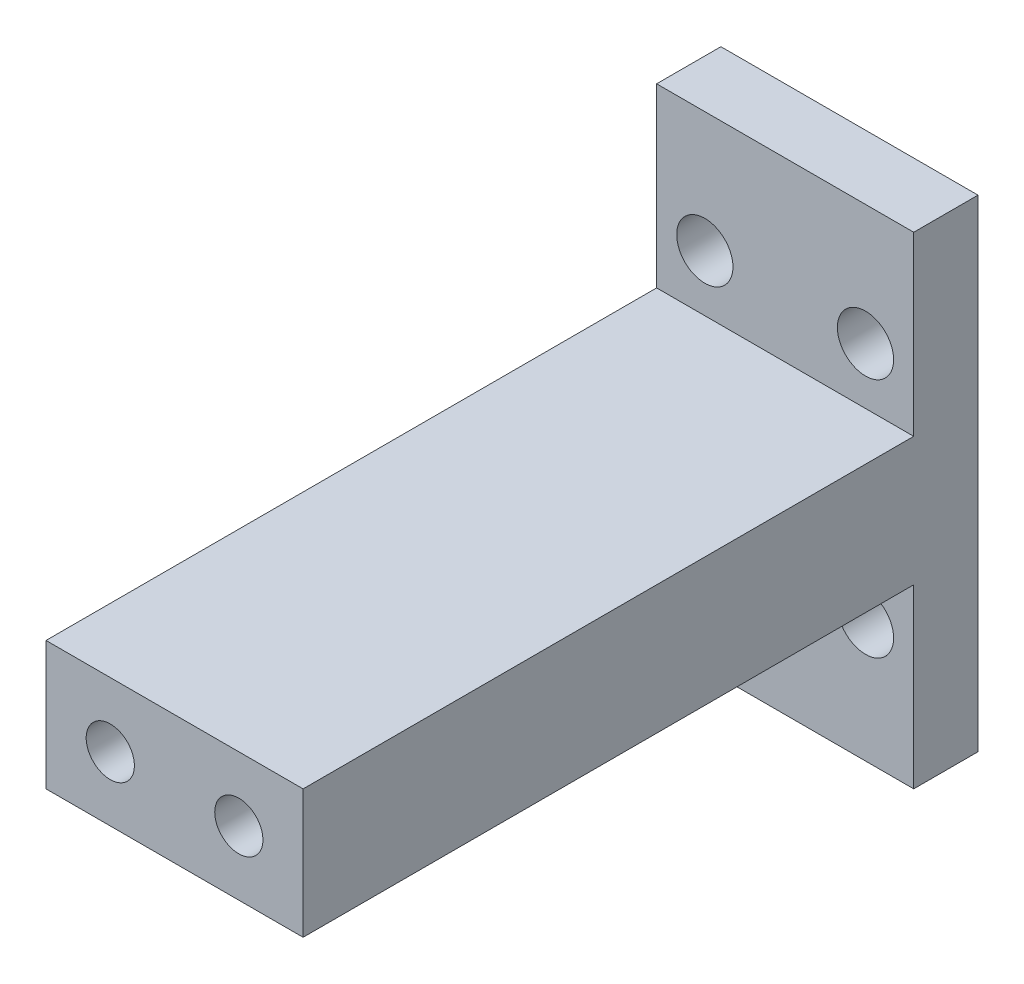
ISO-10303-21;
HEADER;
FILE_DESCRIPTION(('STEP AP214'),'2;1');
FILE_NAME('part.step','',(''),(''),'','','');
FILE_SCHEMA(('AUTOMOTIVE_DESIGN { 1 0 10303 214 1 1 1 1 }'));
ENDSEC;
DATA;
#1=APPLICATION_CONTEXT('core data for automotive mechanical design processes');
#2=APPLICATION_PROTOCOL_DEFINITION('international standard','automotive_design',2000,#1);
#3=PRODUCT_CONTEXT('',#1,'mechanical');
#4=PRODUCT('Part','Part','',(#3));
#5=PRODUCT_RELATED_PRODUCT_CATEGORY('part','',(#4));
#6=PRODUCT_DEFINITION_FORMATION('','',#4);
#7=PRODUCT_DEFINITION_CONTEXT('part definition',#1,'design');
#8=PRODUCT_DEFINITION('design','',#6,#7);
#9=PRODUCT_DEFINITION_SHAPE('','',#8);
#10=(LENGTH_UNIT() NAMED_UNIT(*) SI_UNIT(.MILLI.,.METRE.));
#11=(NAMED_UNIT(*) PLANE_ANGLE_UNIT() SI_UNIT($,.RADIAN.));
#12=(NAMED_UNIT(*) SI_UNIT($,.STERADIAN.) SOLID_ANGLE_UNIT());
#13=UNCERTAINTY_MEASURE_WITH_UNIT(LENGTH_MEASURE(1.E-05),#10,'distance_accuracy_value','');
#14=(GEOMETRIC_REPRESENTATION_CONTEXT(3) GLOBAL_UNCERTAINTY_ASSIGNED_CONTEXT((#13)) GLOBAL_UNIT_ASSIGNED_CONTEXT((#10,
#11,#12)) REPRESENTATION_CONTEXT('',''));
#15=CARTESIAN_POINT('',(0.,0.,0.));
#16=DIRECTION('',(0.,0.,1.));
#17=DIRECTION('',(1.,0.,0.));
#18=AXIS2_PLACEMENT_3D('',#15,#16,#17);
#19=CARTESIAN_POINT('',(0.,0.,4.));
#20=DIRECTION('',(0.,0.,1.));
#21=DIRECTION('',(1.,0.,0.));
#22=AXIS2_PLACEMENT_3D('',#19,#20,#21);
#23=PLANE('',#22);
#24=DIRECTION('',(1.,0.,0.));
#25=VECTOR('',#24,1.);
#26=CARTESIAN_POINT('',(-8.,-4.,4.));
#27=LINE('',#26,#25);
#28=CARTESIAN_POINT('',(-8.,-4.,4.));
#29=VERTEX_POINT('',#28);
#30=CARTESIAN_POINT('',(8.,-4.,4.));
#31=VERTEX_POINT('',#30);
#32=EDGE_CURVE('E55',#29,#31,#27,.T.);
#33=ORIENTED_EDGE('',*,*,#32,.F.);
#34=DIRECTION('',(0.,-1.,0.));
#35=VECTOR('',#34,1.);
#36=CARTESIAN_POINT('',(-8.,15.,4.));
#37=LINE('',#36,#35);
#38=CARTESIAN_POINT('',(-8.,-15.,4.));
#39=VERTEX_POINT('',#38);
#40=EDGE_CURVE('E176',#29,#39,#37,.T.);
#41=ORIENTED_EDGE('',*,*,#40,.T.);
#42=DIRECTION('',(1.,0.,0.));
#43=VECTOR('',#42,1.);
#44=CARTESIAN_POINT('',(-8.,-15.,4.));
#45=LINE('',#44,#43);
#46=CARTESIAN_POINT('',(8.,-15.,4.));
#47=VERTEX_POINT('',#46);
#48=EDGE_CURVE('E180',#39,#47,#45,.T.);
#49=ORIENTED_EDGE('',*,*,#48,.T.);
#50=DIRECTION('',(0.,1.,0.));
#51=VECTOR('',#50,1.);
#52=CARTESIAN_POINT('',(8.,15.,4.));
#53=LINE('',#52,#51);
#54=EDGE_CURVE('E170',#47,#31,#53,.T.);
#55=ORIENTED_EDGE('',*,*,#54,.T.);
#56=EDGE_LOOP('',(#33,#41,#49,#55));
#57=FACE_BOUND('',#56,.T.);
#58=CARTESIAN_POINT('',(-5.,-7.5,4.));
#59=DIRECTION('',(0.,0.,1.));
#60=DIRECTION('',(-1.,0.,0.));
#61=AXIS2_PLACEMENT_3D('',#58,#59,#60);
#62=CIRCLE('',#61,1.75);
#63=CARTESIAN_POINT('',(-6.75,-7.5,4.));
#64=VERTEX_POINT('',#63);
#65=EDGE_CURVE('E136',#64,#64,#62,.T.);
#66=ORIENTED_EDGE('',*,*,#65,.F.);
#67=EDGE_LOOP('',(#66));
#68=FACE_BOUND('',#67,.T.);
#69=CARTESIAN_POINT('',(5.,-7.5,4.));
#70=DIRECTION('',(0.,0.,1.));
#71=DIRECTION('',(1.,0.,0.));
#72=AXIS2_PLACEMENT_3D('',#69,#70,#71);
#73=CIRCLE('',#72,1.75);
#74=CARTESIAN_POINT('',(6.75,-7.5,4.));
#75=VERTEX_POINT('',#74);
#76=EDGE_CURVE('E146',#75,#75,#73,.T.);
#77=ORIENTED_EDGE('',*,*,#76,.F.);
#78=EDGE_LOOP('',(#77));
#79=FACE_BOUND('',#78,.T.);
#80=ADVANCED_FACE('F39',(#57,#68,#79),#23,.T.);
#81=DIRECTION('',(-1.,0.,0.));
#82=VECTOR('',#81,1.);
#83=CARTESIAN_POINT('',(-8.,4.,4.));
#84=LINE('',#83,#82);
#85=CARTESIAN_POINT('',(8.,4.,4.));
#86=VERTEX_POINT('',#85);
#87=CARTESIAN_POINT('',(-8.,4.,4.));
#88=VERTEX_POINT('',#87);
#89=EDGE_CURVE('E63',#86,#88,#84,.T.);
#90=ORIENTED_EDGE('',*,*,#89,.F.);
#91=CARTESIAN_POINT('',(8.,15.,4.));
#92=VERTEX_POINT('',#91);
#93=EDGE_CURVE('E129',#86,#92,#53,.T.);
#94=ORIENTED_EDGE('',*,*,#93,.T.);
#95=DIRECTION('',(-1.,0.,0.));
#96=VECTOR('',#95,1.);
#97=CARTESIAN_POINT('',(-8.,15.,4.));
#98=LINE('',#97,#96);
#99=CARTESIAN_POINT('',(-8.,15.,4.));
#100=VERTEX_POINT('',#99);
#101=EDGE_CURVE('E173',#92,#100,#98,.T.);
#102=ORIENTED_EDGE('',*,*,#101,.T.);
#103=EDGE_CURVE('E177',#100,#88,#37,.T.);
#104=ORIENTED_EDGE('',*,*,#103,.T.);
#105=EDGE_LOOP('',(#90,#94,#102,#104));
#106=FACE_BOUND('',#105,.T.);
#107=CARTESIAN_POINT('',(-5.,7.5,4.));
#108=DIRECTION('',(0.,0.,1.));
#109=DIRECTION('',(1.,0.,0.));
#110=AXIS2_PLACEMENT_3D('',#107,#108,#109);
#111=CIRCLE('',#110,1.75);
#112=CARTESIAN_POINT('',(-3.25,7.5,4.));
#113=VERTEX_POINT('',#112);
#114=EDGE_CURVE('E162',#113,#113,#111,.T.);
#115=ORIENTED_EDGE('',*,*,#114,.F.);
#116=EDGE_LOOP('',(#115));
#117=FACE_BOUND('',#116,.T.);
#118=CARTESIAN_POINT('',(5.,7.5,4.));
#119=DIRECTION('',(0.,0.,1.));
#120=DIRECTION('',(-1.,0.,0.));
#121=AXIS2_PLACEMENT_3D('',#118,#119,#120);
#122=CIRCLE('',#121,1.75);
#123=CARTESIAN_POINT('',(3.25,7.5,4.));
#124=VERTEX_POINT('',#123);
#125=EDGE_CURVE('E154',#124,#124,#122,.T.);
#126=ORIENTED_EDGE('',*,*,#125,.F.);
#127=EDGE_LOOP('',(#126));
#128=FACE_BOUND('',#127,.T.);
#129=ADVANCED_FACE('F281',(#106,#117,#128),#23,.T.);
#130=CARTESIAN_POINT('',(0.,0.,0.));
#131=DIRECTION('',(0.,0.,1.));
#132=DIRECTION('',(1.,0.,0.));
#133=AXIS2_PLACEMENT_3D('',#130,#131,#132);
#134=PLANE('',#133);
#135=DIRECTION('',(0.,1.,0.));
#136=VECTOR('',#135,1.);
#137=CARTESIAN_POINT('',(8.,15.,0.));
#138=LINE('',#137,#136);
#139=CARTESIAN_POINT('',(8.,-15.,0.));
#140=VERTEX_POINT('',#139);
#141=CARTESIAN_POINT('',(8.,15.,0.));
#142=VERTEX_POINT('',#141);
#143=EDGE_CURVE('E166',#140,#142,#138,.T.);
#144=ORIENTED_EDGE('',*,*,#143,.F.);
#145=DIRECTION('',(1.,0.,0.));
#146=VECTOR('',#145,1.);
#147=CARTESIAN_POINT('',(-8.,-15.,0.));
#148=LINE('',#147,#146);
#149=CARTESIAN_POINT('',(-8.,-15.,0.));
#150=VERTEX_POINT('',#149);
#151=EDGE_CURVE('E192',#150,#140,#148,.T.);
#152=ORIENTED_EDGE('',*,*,#151,.F.);
#153=DIRECTION('',(0.,-1.,0.));
#154=VECTOR('',#153,1.);
#155=CARTESIAN_POINT('',(-8.,15.,0.));
#156=LINE('',#155,#154);
#157=CARTESIAN_POINT('',(-8.,15.,0.));
#158=VERTEX_POINT('',#157);
#159=EDGE_CURVE('E189',#158,#150,#156,.T.);
#160=ORIENTED_EDGE('',*,*,#159,.F.);
#161=DIRECTION('',(-1.,0.,0.));
#162=VECTOR('',#161,1.);
#163=CARTESIAN_POINT('',(-8.,15.,0.));
#164=LINE('',#163,#162);
#165=EDGE_CURVE('E186',#142,#158,#164,.T.);
#166=ORIENTED_EDGE('',*,*,#165,.F.);
#167=EDGE_LOOP('',(#144,#152,#160,#166));
#168=FACE_BOUND('',#167,.T.);
#169=CARTESIAN_POINT('',(-5.,7.5,0.));
#170=DIRECTION('',(0.,0.,1.));
#171=DIRECTION('',(1.,0.,0.));
#172=AXIS2_PLACEMENT_3D('',#169,#170,#171);
#173=CIRCLE('',#172,1.75);
#174=CARTESIAN_POINT('',(-3.25,7.5,0.));
#175=VERTEX_POINT('',#174);
#176=EDGE_CURVE('E158',#175,#175,#173,.T.);
#177=ORIENTED_EDGE('',*,*,#176,.T.);
#178=EDGE_LOOP('',(#177));
#179=FACE_BOUND('',#178,.T.);
#180=CARTESIAN_POINT('',(5.,7.5,0.));
#181=DIRECTION('',(0.,0.,1.));
#182=DIRECTION('',(-1.,0.,0.));
#183=AXIS2_PLACEMENT_3D('',#180,#181,#182);
#184=CIRCLE('',#183,1.75);
#185=CARTESIAN_POINT('',(3.25,7.5,0.));
#186=VERTEX_POINT('',#185);
#187=EDGE_CURVE('E150',#186,#186,#184,.T.);
#188=ORIENTED_EDGE('',*,*,#187,.T.);
#189=EDGE_LOOP('',(#188));
#190=FACE_BOUND('',#189,.T.);
#191=CARTESIAN_POINT('',(5.,-7.5,0.));
#192=DIRECTION('',(0.,0.,1.));
#193=DIRECTION('',(1.,0.,0.));
#194=AXIS2_PLACEMENT_3D('',#191,#192,#193);
#195=CIRCLE('',#194,1.75);
#196=CARTESIAN_POINT('',(6.75,-7.5,0.));
#197=VERTEX_POINT('',#196);
#198=EDGE_CURVE('E144',#197,#197,#195,.T.);
#199=ORIENTED_EDGE('',*,*,#198,.T.);
#200=EDGE_LOOP('',(#199));
#201=FACE_BOUND('',#200,.T.);
#202=CARTESIAN_POINT('',(-5.,-7.5,0.));
#203=DIRECTION('',(0.,0.,1.));
#204=DIRECTION('',(-1.,0.,0.));
#205=AXIS2_PLACEMENT_3D('',#202,#203,#204);
#206=CIRCLE('',#205,1.75);
#207=CARTESIAN_POINT('',(-6.75,-7.5,0.));
#208=VERTEX_POINT('',#207);
#209=EDGE_CURVE('E131',#208,#208,#206,.T.);
#210=ORIENTED_EDGE('',*,*,#209,.T.);
#211=EDGE_LOOP('',(#210));
#212=FACE_BOUND('',#211,.T.);
#213=ADVANCED_FACE('F214',(#168,#179,#190,#201,#212),#134,.F.);
#214=CARTESIAN_POINT('',(8.,15.,4.));
#215=DIRECTION('',(-1.,0.,0.));
#216=DIRECTION('',(0.,-1.,0.));
#217=AXIS2_PLACEMENT_3D('',#214,#215,#216);
#218=PLANE('',#217);
#219=ORIENTED_EDGE('',*,*,#143,.T.);
#220=DIRECTION('',(0.,0.,-1.));
#221=VECTOR('',#220,1.);
#222=CARTESIAN_POINT('',(8.,15.,4.));
#223=LINE('',#222,#221);
#224=EDGE_CURVE('E11',#92,#142,#223,.T.);
#225=ORIENTED_EDGE('',*,*,#224,.F.);
#226=ORIENTED_EDGE('',*,*,#93,.F.);
#227=DIRECTION('',(0.,0.,-1.));
#228=VECTOR('',#227,1.);
#229=CARTESIAN_POINT('',(8.,4.,42.));
#230=LINE('',#229,#228);
#231=CARTESIAN_POINT('',(8.,4.,42.));
#232=VERTEX_POINT('',#231);
#233=EDGE_CURVE('E109',#232,#86,#230,.T.);
#234=ORIENTED_EDGE('',*,*,#233,.F.);
#235=DIRECTION('',(0.,1.,0.));
#236=VECTOR('',#235,1.);
#237=CARTESIAN_POINT('',(8.,4.,42.));
#238=LINE('',#237,#236);
#239=CARTESIAN_POINT('',(8.,-4.,42.));
#240=VERTEX_POINT('',#239);
#241=EDGE_CURVE('E116',#240,#232,#238,.T.);
#242=ORIENTED_EDGE('',*,*,#241,.F.);
#243=DIRECTION('',(0.,0.,-1.));
#244=VECTOR('',#243,1.);
#245=CARTESIAN_POINT('',(8.,-4.,42.));
#246=LINE('',#245,#244);
#247=EDGE_CURVE('E221',#240,#31,#246,.T.);
#248=ORIENTED_EDGE('',*,*,#247,.T.);
#249=ORIENTED_EDGE('',*,*,#54,.F.);
#250=DIRECTION('',(0.,0.,-1.));
#251=VECTOR('',#250,1.);
#252=CARTESIAN_POINT('',(8.,-15.,4.));
#253=LINE('',#252,#251);
#254=EDGE_CURVE('E183',#47,#140,#253,.T.);
#255=ORIENTED_EDGE('',*,*,#254,.T.);
#256=EDGE_LOOP('',(#219,#225,#226,#234,#242,#248,#249,#255));
#257=FACE_BOUND('',#256,.T.);
#258=ADVANCED_FACE('F41',(#257),#218,.F.);
#259=CARTESIAN_POINT('',(-8.,15.,4.));
#260=DIRECTION('',(0.,-1.,0.));
#261=DIRECTION('',(0.,0.,-1.));
#262=AXIS2_PLACEMENT_3D('',#259,#260,#261);
#263=PLANE('',#262);
#264=ORIENTED_EDGE('',*,*,#165,.T.);
#265=DIRECTION('',(0.,0.,-1.));
#266=VECTOR('',#265,1.);
#267=CARTESIAN_POINT('',(-8.,15.,4.));
#268=LINE('',#267,#266);
#269=EDGE_CURVE('E48',#100,#158,#268,.T.);
#270=ORIENTED_EDGE('',*,*,#269,.F.);
#271=ORIENTED_EDGE('',*,*,#101,.F.);
#272=ORIENTED_EDGE('',*,*,#224,.T.);
#273=EDGE_LOOP('',(#264,#270,#271,#272));
#274=FACE_BOUND('',#273,.T.);
#275=ADVANCED_FACE('F296',(#274),#263,.F.);
#276=CARTESIAN_POINT('',(-8.,15.,4.));
#277=DIRECTION('',(1.,0.,0.));
#278=DIRECTION('',(0.,1.,0.));
#279=AXIS2_PLACEMENT_3D('',#276,#277,#278);
#280=PLANE('',#279);
#281=ORIENTED_EDGE('',*,*,#159,.T.);
#282=DIRECTION('',(0.,0.,-1.));
#283=VECTOR('',#282,1.);
#284=CARTESIAN_POINT('',(-8.,-15.,4.));
#285=LINE('',#284,#283);
#286=EDGE_CURVE('E198',#39,#150,#285,.T.);
#287=ORIENTED_EDGE('',*,*,#286,.F.);
#288=ORIENTED_EDGE('',*,*,#40,.F.);
#289=DIRECTION('',(0.,0.,-1.));
#290=VECTOR('',#289,1.);
#291=CARTESIAN_POINT('',(-8.,-4.,42.));
#292=LINE('',#291,#290);
#293=CARTESIAN_POINT('',(-8.,-4.,42.));
#294=VERTEX_POINT('',#293);
#295=EDGE_CURVE('E138',#294,#29,#292,.T.);
#296=ORIENTED_EDGE('',*,*,#295,.F.);
#297=DIRECTION('',(0.,-1.,0.));
#298=VECTOR('',#297,1.);
#299=CARTESIAN_POINT('',(-8.,4.,42.));
#300=LINE('',#299,#298);
#301=CARTESIAN_POINT('',(-8.,4.,42.));
#302=VERTEX_POINT('',#301);
#303=EDGE_CURVE('E115',#302,#294,#300,.T.);
#304=ORIENTED_EDGE('',*,*,#303,.F.);
#305=DIRECTION('',(0.,0.,-1.));
#306=VECTOR('',#305,1.);
#307=CARTESIAN_POINT('',(-8.,4.,42.));
#308=LINE('',#307,#306);
#309=EDGE_CURVE('E111',#302,#88,#308,.T.);
#310=ORIENTED_EDGE('',*,*,#309,.T.);
#311=ORIENTED_EDGE('',*,*,#103,.F.);
#312=ORIENTED_EDGE('',*,*,#269,.T.);
#313=EDGE_LOOP('',(#281,#287,#288,#296,#304,#310,#311,#312));
#314=FACE_BOUND('',#313,.T.);
#315=ADVANCED_FACE('F207',(#314),#280,.F.);
#316=CARTESIAN_POINT('',(-8.,-15.,4.));
#317=DIRECTION('',(0.,1.,0.));
#318=DIRECTION('',(0.,0.,1.));
#319=AXIS2_PLACEMENT_3D('',#316,#317,#318);
#320=PLANE('',#319);
#321=ORIENTED_EDGE('',*,*,#151,.T.);
#322=ORIENTED_EDGE('',*,*,#254,.F.);
#323=ORIENTED_EDGE('',*,*,#48,.F.);
#324=ORIENTED_EDGE('',*,*,#286,.T.);
#325=EDGE_LOOP('',(#321,#322,#323,#324));
#326=FACE_BOUND('',#325,.T.);
#327=ADVANCED_FACE('F218',(#326),#320,.F.);
#328=CARTESIAN_POINT('',(-5.,7.5,4.));
#329=DIRECTION('',(0.,0.,-1.));
#330=DIRECTION('',(-1.,0.,0.));
#331=AXIS2_PLACEMENT_3D('',#328,#329,#330);
#332=CYLINDRICAL_SURFACE('',#331,1.75);
#333=ORIENTED_EDGE('',*,*,#114,.T.);
#334=EDGE_LOOP('',(#333));
#335=FACE_BOUND('',#334,.T.);
#336=ORIENTED_EDGE('',*,*,#176,.F.);
#337=EDGE_LOOP('',(#336));
#338=FACE_BOUND('',#337,.T.);
#339=ADVANCED_FACE('F289',(#335,#338),#332,.F.);
#340=CARTESIAN_POINT('',(5.,7.5,4.));
#341=DIRECTION('',(0.,0.,-1.));
#342=DIRECTION('',(-1.,0.,0.));
#343=AXIS2_PLACEMENT_3D('',#340,#341,#342);
#344=CYLINDRICAL_SURFACE('',#343,1.75);
#345=ORIENTED_EDGE('',*,*,#125,.T.);
#346=EDGE_LOOP('',(#345));
#347=FACE_BOUND('',#346,.T.);
#348=ORIENTED_EDGE('',*,*,#187,.F.);
#349=EDGE_LOOP('',(#348));
#350=FACE_BOUND('',#349,.T.);
#351=ADVANCED_FACE('F308',(#347,#350),#344,.F.);
#352=CARTESIAN_POINT('',(5.,-7.5,4.));
#353=DIRECTION('',(0.,0.,-1.));
#354=DIRECTION('',(-1.,0.,0.));
#355=AXIS2_PLACEMENT_3D('',#352,#353,#354);
#356=CYLINDRICAL_SURFACE('',#355,1.75);
#357=ORIENTED_EDGE('',*,*,#76,.T.);
#358=EDGE_LOOP('',(#357));
#359=FACE_BOUND('',#358,.T.);
#360=ORIENTED_EDGE('',*,*,#198,.F.);
#361=EDGE_LOOP('',(#360));
#362=FACE_BOUND('',#361,.T.);
#363=ADVANCED_FACE('F311',(#359,#362),#356,.F.);
#364=CARTESIAN_POINT('',(-5.,-7.5,4.));
#365=DIRECTION('',(0.,0.,-1.));
#366=DIRECTION('',(-1.,0.,0.));
#367=AXIS2_PLACEMENT_3D('',#364,#365,#366);
#368=CYLINDRICAL_SURFACE('',#367,1.75);
#369=ORIENTED_EDGE('',*,*,#65,.T.);
#370=EDGE_LOOP('',(#369));
#371=FACE_BOUND('',#370,.T.);
#372=ORIENTED_EDGE('',*,*,#209,.F.);
#373=EDGE_LOOP('',(#372));
#374=FACE_BOUND('',#373,.T.);
#375=ADVANCED_FACE('F319',(#371,#374),#368,.F.);
#376=CARTESIAN_POINT('',(-8.,4.,42.));
#377=DIRECTION('',(0.,-1.,0.));
#378=DIRECTION('',(0.,0.,-1.));
#379=AXIS2_PLACEMENT_3D('',#376,#377,#378);
#380=PLANE('',#379);
#381=ORIENTED_EDGE('',*,*,#89,.T.);
#382=ORIENTED_EDGE('',*,*,#309,.F.);
#383=DIRECTION('',(-1.,0.,0.));
#384=VECTOR('',#383,1.);
#385=CARTESIAN_POINT('',(-8.,4.,42.));
#386=LINE('',#385,#384);
#387=EDGE_CURVE('E105',#232,#302,#386,.T.);
#388=ORIENTED_EDGE('',*,*,#387,.F.);
#389=ORIENTED_EDGE('',*,*,#233,.T.);
#390=EDGE_LOOP('',(#381,#382,#388,#389));
#391=FACE_BOUND('',#390,.T.);
#392=ADVANCED_FACE('F107',(#391),#380,.F.);
#393=CARTESIAN_POINT('',(-8.,-4.,42.));
#394=DIRECTION('',(0.,1.,0.));
#395=DIRECTION('',(0.,0.,1.));
#396=AXIS2_PLACEMENT_3D('',#393,#394,#395);
#397=PLANE('',#396);
#398=ORIENTED_EDGE('',*,*,#32,.T.);
#399=ORIENTED_EDGE('',*,*,#247,.F.);
#400=DIRECTION('',(1.,0.,0.));
#401=VECTOR('',#400,1.);
#402=CARTESIAN_POINT('',(-8.,-4.,42.));
#403=LINE('',#402,#401);
#404=EDGE_CURVE('E121',#294,#240,#403,.T.);
#405=ORIENTED_EDGE('',*,*,#404,.F.);
#406=ORIENTED_EDGE('',*,*,#295,.T.);
#407=EDGE_LOOP('',(#398,#399,#405,#406));
#408=FACE_BOUND('',#407,.T.);
#409=ADVANCED_FACE('F225',(#408),#397,.F.);
#410=CARTESIAN_POINT('',(0.,0.,42.));
#411=DIRECTION('',(0.,0.,1.));
#412=DIRECTION('',(1.,0.,0.));
#413=AXIS2_PLACEMENT_3D('',#410,#411,#412);
#414=PLANE('',#413);
#415=CARTESIAN_POINT('',(-4.,0.,42.));
#416=DIRECTION('',(0.,0.,1.));
#417=DIRECTION('',(1.,0.,0.));
#418=AXIS2_PLACEMENT_3D('',#415,#416,#417);
#419=CIRCLE('',#418,1.5);
#420=CARTESIAN_POINT('',(-2.5,0.,42.));
#421=VERTEX_POINT('',#420);
#422=EDGE_CURVE('E248',#421,#421,#419,.T.);
#423=ORIENTED_EDGE('',*,*,#422,.F.);
#424=EDGE_LOOP('',(#423));
#425=FACE_BOUND('',#424,.T.);
#426=CARTESIAN_POINT('',(4.,0.,42.));
#427=DIRECTION('',(0.,0.,1.));
#428=DIRECTION('',(-1.,0.,0.));
#429=AXIS2_PLACEMENT_3D('',#426,#427,#428);
#430=CIRCLE('',#429,1.5);
#431=CARTESIAN_POINT('',(2.5,0.,42.));
#432=VERTEX_POINT('',#431);
#433=EDGE_CURVE('E240',#432,#432,#430,.T.);
#434=ORIENTED_EDGE('',*,*,#433,.F.);
#435=EDGE_LOOP('',(#434));
#436=FACE_BOUND('',#435,.T.);
#437=ORIENTED_EDGE('',*,*,#241,.T.);
#438=ORIENTED_EDGE('',*,*,#387,.T.);
#439=ORIENTED_EDGE('',*,*,#303,.T.);
#440=ORIENTED_EDGE('',*,*,#404,.T.);
#441=EDGE_LOOP('',(#437,#438,#439,#440));
#442=FACE_BOUND('',#441,.T.);
#443=ADVANCED_FACE('F119',(#425,#436,#442),#414,.T.);
#444=CARTESIAN_POINT('',(4.,0.,32.));
#445=DIRECTION('',(0.,0.,1.));
#446=DIRECTION('',(1.,0.,0.));
#447=AXIS2_PLACEMENT_3D('',#444,#445,#446);
#448=CYLINDRICAL_SURFACE('',#447,1.5);
#449=CARTESIAN_POINT('',(4.,0.,32.));
#450=DIRECTION('',(0.,0.,1.));
#451=DIRECTION('',(-1.,0.,0.));
#452=AXIS2_PLACEMENT_3D('',#449,#450,#451);
#453=CIRCLE('',#452,1.5);
#454=CARTESIAN_POINT('',(2.5,0.,32.));
#455=VERTEX_POINT('',#454);
#456=EDGE_CURVE('E244',#455,#455,#453,.T.);
#457=ORIENTED_EDGE('',*,*,#456,.F.);
#458=EDGE_LOOP('',(#457));
#459=FACE_BOUND('',#458,.T.);
#460=ORIENTED_EDGE('',*,*,#433,.T.);
#461=EDGE_LOOP('',(#460));
#462=FACE_BOUND('',#461,.T.);
#463=ADVANCED_FACE('F267',(#459,#462),#448,.F.);
#464=CARTESIAN_POINT('',(4.,0.,32.));
#465=DIRECTION('',(0.,0.,-1.));
#466=DIRECTION('',(-1.,0.,0.));
#467=AXIS2_PLACEMENT_3D('',#464,#465,#466);
#468=PLANE('',#467);
#469=ORIENTED_EDGE('',*,*,#456,.T.);
#470=EDGE_LOOP('',(#469));
#471=FACE_BOUND('',#470,.T.);
#472=ADVANCED_FACE('F261',(#471),#468,.F.);
#473=CARTESIAN_POINT('',(-4.,0.,32.));
#474=DIRECTION('',(0.,0.,1.));
#475=DIRECTION('',(1.,0.,0.));
#476=AXIS2_PLACEMENT_3D('',#473,#474,#475);
#477=CYLINDRICAL_SURFACE('',#476,1.5);
#478=CARTESIAN_POINT('',(-4.,0.,32.));
#479=DIRECTION('',(0.,0.,1.));
#480=DIRECTION('',(1.,0.,0.));
#481=AXIS2_PLACEMENT_3D('',#478,#479,#480);
#482=CIRCLE('',#481,1.5);
#483=CARTESIAN_POINT('',(-2.5,0.,32.));
#484=VERTEX_POINT('',#483);
#485=EDGE_CURVE('E230',#484,#484,#482,.T.);
#486=ORIENTED_EDGE('',*,*,#485,.F.);
#487=EDGE_LOOP('',(#486));
#488=FACE_BOUND('',#487,.T.);
#489=ORIENTED_EDGE('',*,*,#422,.T.);
#490=EDGE_LOOP('',(#489));
#491=FACE_BOUND('',#490,.T.);
#492=ADVANCED_FACE('F258',(#488,#491),#477,.F.);
#493=CARTESIAN_POINT('',(-4.,0.,32.));
#494=DIRECTION('',(0.,0.,1.));
#495=DIRECTION('',(1.,0.,0.));
#496=AXIS2_PLACEMENT_3D('',#493,#494,#495);
#497=PLANE('',#496);
#498=ORIENTED_EDGE('',*,*,#485,.T.);
#499=EDGE_LOOP('',(#498));
#500=FACE_BOUND('',#499,.T.);
#501=ADVANCED_FACE('F256',(#500),#497,.T.);
#502=CLOSED_SHELL('',(#80,#129,#213,#258,#275,#315,#327,#339,#351,#363,#375,#392,#409,#443,#463,
#472,#492,#501));
#503=MANIFOLD_SOLID_BREP('B2',#502);
#504=ADVANCED_BREP_SHAPE_REPRESENTATION('',(#18,#503),#14);
#505=SHAPE_DEFINITION_REPRESENTATION(#9,#504);
ENDSEC;
END-ISO-10303-21;
